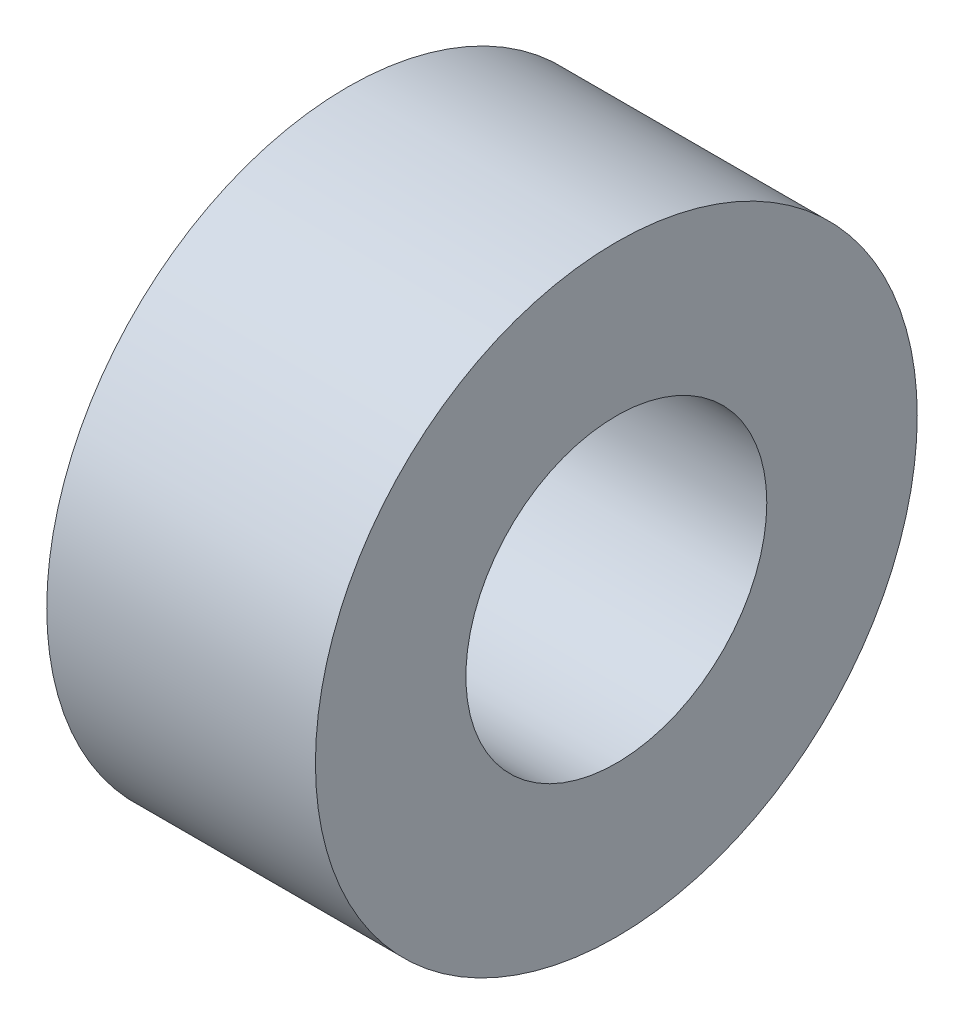
ISO-10303-21;
HEADER;
FILE_DESCRIPTION(('STEP AP214'),'2;1');
FILE_NAME('part.step','',(''),(''),'','','');
FILE_SCHEMA(('AUTOMOTIVE_DESIGN { 1 0 10303 214 1 1 1 1 }'));
ENDSEC;
DATA;
#1=APPLICATION_CONTEXT('core data for automotive mechanical design processes');
#2=APPLICATION_PROTOCOL_DEFINITION('international standard','automotive_design',2000,#1);
#3=PRODUCT_CONTEXT('',#1,'mechanical');
#4=PRODUCT('Part','Part','',(#3));
#5=PRODUCT_RELATED_PRODUCT_CATEGORY('part','',(#4));
#6=PRODUCT_DEFINITION_FORMATION('','',#4);
#7=PRODUCT_DEFINITION_CONTEXT('part definition',#1,'design');
#8=PRODUCT_DEFINITION('design','',#6,#7);
#9=PRODUCT_DEFINITION_SHAPE('','',#8);
#10=(LENGTH_UNIT() NAMED_UNIT(*) SI_UNIT(.MILLI.,.METRE.));
#11=(NAMED_UNIT(*) PLANE_ANGLE_UNIT() SI_UNIT($,.RADIAN.));
#12=(NAMED_UNIT(*) SI_UNIT($,.STERADIAN.) SOLID_ANGLE_UNIT());
#13=UNCERTAINTY_MEASURE_WITH_UNIT(LENGTH_MEASURE(1.E-05),#10,'distance_accuracy_value','');
#14=(GEOMETRIC_REPRESENTATION_CONTEXT(3) GLOBAL_UNCERTAINTY_ASSIGNED_CONTEXT((#13)) GLOBAL_UNIT_ASSIGNED_CONTEXT((#10,
#11,#12)) REPRESENTATION_CONTEXT('',''));
#15=CARTESIAN_POINT('',(0.,0.,0.));
#16=DIRECTION('',(0.,0.,1.));
#17=DIRECTION('',(1.,0.,0.));
#18=AXIS2_PLACEMENT_3D('',#15,#16,#17);
#19=CARTESIAN_POINT('',(324.160808101421,0.,-50.));
#20=DIRECTION('',(1.,0.,0.));
#21=DIRECTION('',(0.,0.,-1.));
#22=AXIS2_PLACEMENT_3D('',#19,#20,#21);
#23=CYLINDRICAL_SURFACE('',#22,2.8);
#24=CARTESIAN_POINT('',(340.,0.,-50.));
#25=DIRECTION('',(1.,0.,0.));
#26=DIRECTION('',(0.,0.,-1.));
#27=AXIS2_PLACEMENT_3D('',#24,#25,#26);
#28=CIRCLE('',#27,2.8);
#29=CARTESIAN_POINT('',(340.,0.,-52.8));
#30=VERTEX_POINT('',#29);
#31=EDGE_CURVE('E60',#30,#30,#28,.F.);
#32=ORIENTED_EDGE('',*,*,#31,.T.);
#33=EDGE_LOOP('',(#32));
#34=FACE_BOUND('',#33,.T.);
#35=CARTESIAN_POINT('',(345.,0.,-50.));
#36=DIRECTION('',(1.,0.,0.));
#37=DIRECTION('',(0.,0.,-1.));
#38=AXIS2_PLACEMENT_3D('',#35,#36,#37);
#39=CIRCLE('',#38,2.8);
#40=CARTESIAN_POINT('',(345.,0.,-52.8));
#41=VERTEX_POINT('',#40);
#42=EDGE_CURVE('E53',#41,#41,#39,.T.);
#43=ORIENTED_EDGE('',*,*,#42,.T.);
#44=EDGE_LOOP('',(#43));
#45=FACE_BOUND('',#44,.T.);
#46=ADVANCED_FACE('F39',(#34,#45),#23,.F.);
#47=CARTESIAN_POINT('',(324.160808101421,0.,-50.));
#48=DIRECTION('',(1.,0.,0.));
#49=DIRECTION('',(0.,0.,-1.));
#50=AXIS2_PLACEMENT_3D('',#47,#48,#49);
#51=CYLINDRICAL_SURFACE('',#50,5.6);
#52=CARTESIAN_POINT('',(340.,0.,-50.));
#53=DIRECTION('',(1.,0.,0.));
#54=DIRECTION('',(0.,0.,-1.));
#55=AXIS2_PLACEMENT_3D('',#52,#53,#54);
#56=CIRCLE('',#55,5.6);
#57=CARTESIAN_POINT('',(340.,0.,-55.6));
#58=VERTEX_POINT('',#57);
#59=EDGE_CURVE('E10',#58,#58,#56,.F.);
#60=ORIENTED_EDGE('',*,*,#59,.F.);
#61=EDGE_LOOP('',(#60));
#62=FACE_BOUND('',#61,.T.);
#63=CARTESIAN_POINT('',(345.,0.,-50.));
#64=DIRECTION('',(1.,0.,0.));
#65=DIRECTION('',(0.,0.,-1.));
#66=AXIS2_PLACEMENT_3D('',#63,#64,#65);
#67=CIRCLE('',#66,5.6);
#68=CARTESIAN_POINT('',(345.,0.,-55.6));
#69=VERTEX_POINT('',#68);
#70=EDGE_CURVE('E47',#69,#69,#67,.T.);
#71=ORIENTED_EDGE('',*,*,#70,.F.);
#72=EDGE_LOOP('',(#71));
#73=FACE_BOUND('',#72,.T.);
#74=ADVANCED_FACE('F74',(#62,#73),#51,.T.);
#75=CARTESIAN_POINT('',(345.,0.,0.));
#76=DIRECTION('',(1.,0.,0.));
#77=DIRECTION('',(0.,0.,-1.));
#78=AXIS2_PLACEMENT_3D('',#75,#76,#77);
#79=PLANE('',#78);
#80=ORIENTED_EDGE('',*,*,#42,.F.);
#81=EDGE_LOOP('',(#80));
#82=FACE_BOUND('',#81,.T.);
#83=ORIENTED_EDGE('',*,*,#70,.T.);
#84=EDGE_LOOP('',(#83));
#85=FACE_BOUND('',#84,.T.);
#86=ADVANCED_FACE('F70',(#82,#85),#79,.T.);
#87=CARTESIAN_POINT('',(340.,0.,-50.));
#88=DIRECTION('',(1.,0.,0.));
#89=DIRECTION('',(0.,0.,-1.));
#90=AXIS2_PLACEMENT_3D('',#87,#88,#89);
#91=PLANE('',#90);
#92=ORIENTED_EDGE('',*,*,#59,.T.);
#93=EDGE_LOOP('',(#92));
#94=FACE_BOUND('',#93,.T.);
#95=ORIENTED_EDGE('',*,*,#31,.F.);
#96=EDGE_LOOP('',(#95));
#97=FACE_BOUND('',#96,.T.);
#98=ADVANCED_FACE('F41',(#94,#97),#91,.F.);
#99=CLOSED_SHELL('',(#46,#74,#86,#98));
#100=MANIFOLD_SOLID_BREP('B2',#99);
#101=ADVANCED_BREP_SHAPE_REPRESENTATION('',(#18,#100),#14);
#102=SHAPE_DEFINITION_REPRESENTATION(#9,#101);
ENDSEC;
END-ISO-10303-21;
